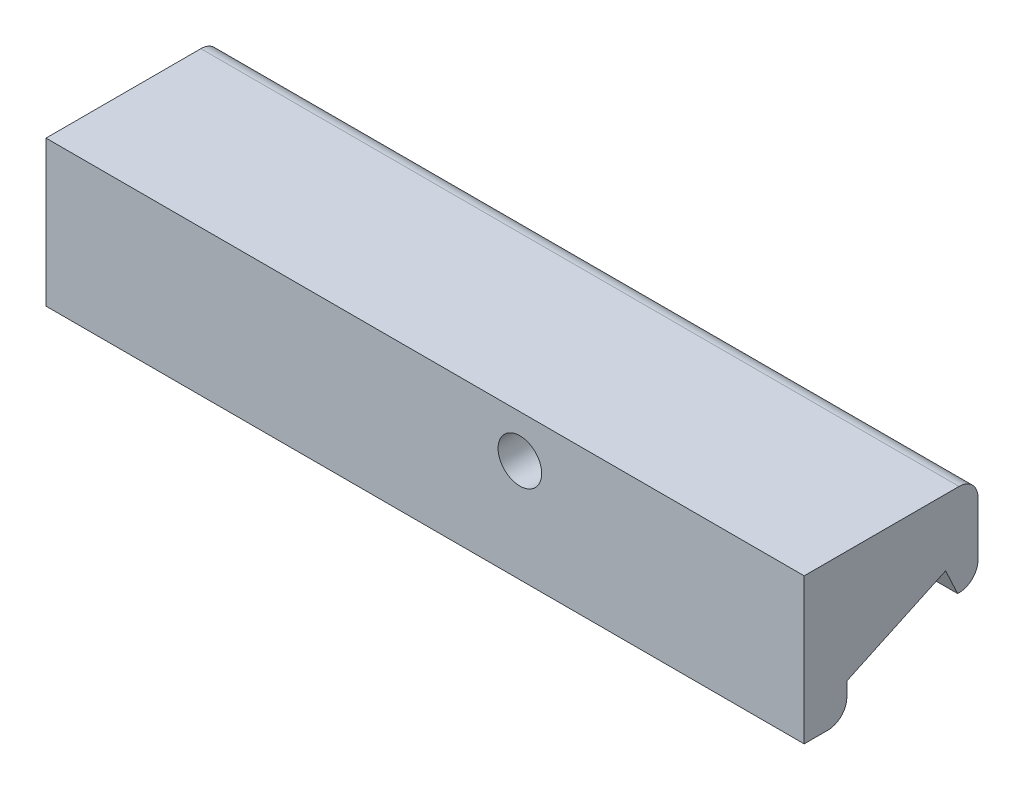
ISO-10303-21;
HEADER;
FILE_DESCRIPTION(('STEP AP214'),'2;1');
FILE_NAME('part.step','',(''),(''),'','','');
FILE_SCHEMA(('AUTOMOTIVE_DESIGN { 1 0 10303 214 1 1 1 1 }'));
ENDSEC;
DATA;
#1=APPLICATION_CONTEXT('core data for automotive mechanical design processes');
#2=APPLICATION_PROTOCOL_DEFINITION('international standard','automotive_design',2000,#1);
#3=PRODUCT_CONTEXT('',#1,'mechanical');
#4=PRODUCT('Part','Part','',(#3));
#5=PRODUCT_RELATED_PRODUCT_CATEGORY('part','',(#4));
#6=PRODUCT_DEFINITION_FORMATION('','',#4);
#7=PRODUCT_DEFINITION_CONTEXT('part definition',#1,'design');
#8=PRODUCT_DEFINITION('design','',#6,#7);
#9=PRODUCT_DEFINITION_SHAPE('','',#8);
#10=(LENGTH_UNIT() NAMED_UNIT(*) SI_UNIT(.MILLI.,.METRE.));
#11=(NAMED_UNIT(*) PLANE_ANGLE_UNIT() SI_UNIT($,.RADIAN.));
#12=(NAMED_UNIT(*) SI_UNIT($,.STERADIAN.) SOLID_ANGLE_UNIT());
#13=UNCERTAINTY_MEASURE_WITH_UNIT(LENGTH_MEASURE(1.E-05),#10,'distance_accuracy_value','');
#14=(GEOMETRIC_REPRESENTATION_CONTEXT(3) GLOBAL_UNCERTAINTY_ASSIGNED_CONTEXT((#13)) GLOBAL_UNIT_ASSIGNED_CONTEXT((#10,
#11,#12)) REPRESENTATION_CONTEXT('',''));
#15=CARTESIAN_POINT('',(0.,0.,0.));
#16=DIRECTION('',(0.,0.,1.));
#17=DIRECTION('',(1.,0.,0.));
#18=AXIS2_PLACEMENT_3D('',#15,#16,#17);
#19=CARTESIAN_POINT('',(80.,15.360110010018,0.));
#20=DIRECTION('',(0.,0.,-1.));
#21=DIRECTION('',(0.,1.,0.));
#22=AXIS2_PLACEMENT_3D('',#19,#20,#21);
#23=PLANE('',#22);
#24=CARTESIAN_POINT('',(50.,10.860110010018,0.));
#25=DIRECTION('',(0.,0.,1.));
#26=DIRECTION('',(1.,0.,0.));
#27=AXIS2_PLACEMENT_3D('',#24,#25,#26);
#28=CIRCLE('',#27,2.3);
#29=CARTESIAN_POINT('',(52.3,10.860110010018,0.));
#30=VERTEX_POINT('',#29);
#31=EDGE_CURVE('E219',#30,#30,#28,.T.);
#32=ORIENTED_EDGE('',*,*,#31,.F.);
#33=EDGE_LOOP('',(#32));
#34=FACE_BOUND('',#33,.T.);
#35=DIRECTION('',(0.,-1.,0.));
#36=VECTOR('',#35,1.);
#37=CARTESIAN_POINT('',(0.,15.360110010018,0.));
#38=LINE('',#37,#36);
#39=CARTESIAN_POINT('',(0.,15.360110010018,0.));
#40=VERTEX_POINT('',#39);
#41=CARTESIAN_POINT('',(0.,0.,0.));
#42=VERTEX_POINT('',#41);
#43=EDGE_CURVE('E147',#40,#42,#38,.T.);
#44=ORIENTED_EDGE('',*,*,#43,.T.);
#45=DIRECTION('',(-1.,0.,0.));
#46=VECTOR('',#45,1.);
#47=CARTESIAN_POINT('',(80.,0.,0.));
#48=LINE('',#47,#46);
#49=CARTESIAN_POINT('',(80.,0.,0.));
#50=VERTEX_POINT('',#49);
#51=EDGE_CURVE('E11',#50,#42,#48,.T.);
#52=ORIENTED_EDGE('',*,*,#51,.F.);
#53=DIRECTION('',(0.,-1.,0.));
#54=VECTOR('',#53,1.);
#55=CARTESIAN_POINT('',(80.,15.360110010018,0.));
#56=LINE('',#55,#54);
#57=CARTESIAN_POINT('',(80.,15.360110010018,0.));
#58=VERTEX_POINT('',#57);
#59=EDGE_CURVE('E166',#58,#50,#56,.T.);
#60=ORIENTED_EDGE('',*,*,#59,.F.);
#61=DIRECTION('',(-1.,0.,0.));
#62=VECTOR('',#61,1.);
#63=CARTESIAN_POINT('',(80.,15.360110010018,0.));
#64=LINE('',#63,#62);
#65=EDGE_CURVE('E143',#58,#40,#64,.T.);
#66=ORIENTED_EDGE('',*,*,#65,.T.);
#67=EDGE_LOOP('',(#44,#52,#60,#66));
#68=FACE_BOUND('',#67,.T.);
#69=ADVANCED_FACE('F39',(#34,#68),#23,.F.);
#70=CARTESIAN_POINT('',(80.,0.,0.));
#71=DIRECTION('',(0.,1.,0.));
#72=DIRECTION('',(0.,0.,1.));
#73=AXIS2_PLACEMENT_3D('',#70,#71,#72);
#74=PLANE('',#73);
#75=DIRECTION('',(0.,0.,-1.));
#76=VECTOR('',#75,1.);
#77=CARTESIAN_POINT('',(0.,0.,0.));
#78=LINE('',#77,#76);
#79=CARTESIAN_POINT('',(0.,0.,-2.4994615533352));
#80=VERTEX_POINT('',#79);
#81=EDGE_CURVE('E150',#42,#80,#78,.T.);
#82=ORIENTED_EDGE('',*,*,#81,.T.);
#83=DIRECTION('',(-1.,0.,0.));
#84=VECTOR('',#83,1.);
#85=CARTESIAN_POINT('',(80.,0.,-2.4994615533352));
#86=LINE('',#85,#84);
#87=CARTESIAN_POINT('',(80.,0.,-2.4994615533352));
#88=VERTEX_POINT('',#87);
#89=EDGE_CURVE('E47',#88,#80,#86,.T.);
#90=ORIENTED_EDGE('',*,*,#89,.F.);
#91=DIRECTION('',(0.,0.,-1.));
#92=VECTOR('',#91,1.);
#93=CARTESIAN_POINT('',(80.,0.,0.));
#94=LINE('',#93,#92);
#95=EDGE_CURVE('E104',#50,#88,#94,.T.);
#96=ORIENTED_EDGE('',*,*,#95,.F.);
#97=ORIENTED_EDGE('',*,*,#51,.T.);
#98=EDGE_LOOP('',(#82,#90,#96,#97));
#99=FACE_BOUND('',#98,.T.);
#100=ADVANCED_FACE('F236',(#99),#74,.F.);
#101=CARTESIAN_POINT('',(80.,2.0005384466648,-2.4994615533352));
#102=DIRECTION('',(-1.,0.,0.));
#103=DIRECTION('',(0.,0.,1.));
#104=AXIS2_PLACEMENT_3D('',#101,#102,#103);
#105=CYLINDRICAL_SURFACE('',#104,2.0005384466648);
#106=CARTESIAN_POINT('',(0.,2.0005384466648,-2.4994615533352));
#107=DIRECTION('',(1.,0.,0.));
#108=DIRECTION('',(0.,0.,-1.));
#109=AXIS2_PLACEMENT_3D('',#106,#107,#108);
#110=CIRCLE('',#109,2.0005384466648);
#111=CARTESIAN_POINT('',(0.,2.0005384466648,-4.5));
#112=VERTEX_POINT('',#111);
#113=EDGE_CURVE('E153',#80,#112,#110,.T.);
#114=ORIENTED_EDGE('',*,*,#113,.T.);
#115=DIRECTION('',(-1.,0.,0.));
#116=VECTOR('',#115,1.);
#117=CARTESIAN_POINT('',(80.,2.0005384466648,-4.5));
#118=LINE('',#117,#116);
#119=CARTESIAN_POINT('',(80.,2.0005384466648,-4.5));
#120=VERTEX_POINT('',#119);
#121=EDGE_CURVE('E179',#120,#112,#118,.T.);
#122=ORIENTED_EDGE('',*,*,#121,.F.);
#123=CARTESIAN_POINT('',(80.,2.0005384466648,-2.4994615533352));
#124=DIRECTION('',(1.,0.,0.));
#125=DIRECTION('',(0.,0.,-1.));
#126=AXIS2_PLACEMENT_3D('',#123,#124,#125);
#127=CIRCLE('',#126,2.0005384466648);
#128=EDGE_CURVE('E187',#88,#120,#127,.T.);
#129=ORIENTED_EDGE('',*,*,#128,.F.);
#130=ORIENTED_EDGE('',*,*,#89,.T.);
#131=EDGE_LOOP('',(#114,#122,#129,#130));
#132=FACE_BOUND('',#131,.T.);
#133=ADVANCED_FACE('F185',(#132),#105,.T.);
#134=CARTESIAN_POINT('',(80.,3.5,-4.5));
#135=DIRECTION('',(0.,0.,1.));
#136=DIRECTION('',(0.,-1.,0.));
#137=AXIS2_PLACEMENT_3D('',#134,#135,#136);
#138=PLANE('',#137);
#139=DIRECTION('',(0.,1.,0.));
#140=VECTOR('',#139,1.);
#141=CARTESIAN_POINT('',(0.,3.5,-4.5));
#142=LINE('',#141,#140);
#143=CARTESIAN_POINT('',(0.,3.5,-4.5));
#144=VERTEX_POINT('',#143);
#145=EDGE_CURVE('E155',#112,#144,#142,.T.);
#146=ORIENTED_EDGE('',*,*,#145,.T.);
#147=DIRECTION('',(-1.,0.,0.));
#148=VECTOR('',#147,1.);
#149=CARTESIAN_POINT('',(80.,3.5,-4.5));
#150=LINE('',#149,#148);
#151=CARTESIAN_POINT('',(80.,3.5,-4.5));
#152=VERTEX_POINT('',#151);
#153=EDGE_CURVE('E176',#152,#144,#150,.T.);
#154=ORIENTED_EDGE('',*,*,#153,.F.);
#155=DIRECTION('',(0.,1.,0.));
#156=VECTOR('',#155,1.);
#157=CARTESIAN_POINT('',(80.,3.5,-4.5));
#158=LINE('',#157,#156);
#159=EDGE_CURVE('E205',#120,#152,#158,.T.);
#160=ORIENTED_EDGE('',*,*,#159,.F.);
#161=ORIENTED_EDGE('',*,*,#121,.T.);
#162=EDGE_LOOP('',(#146,#154,#160,#161));
#163=FACE_BOUND('',#162,.T.);
#164=ADVANCED_FACE('F196',(#163),#138,.F.);
#165=CARTESIAN_POINT('',(80.,8.36011001001802,-14.9225395509215));
#166=DIRECTION('',(0.,0.906307787036651,0.422618261740697));
#167=DIRECTION('',(0.,-0.422618261740697,0.906307787036651));
#168=AXIS2_PLACEMENT_3D('',#165,#166,#167);
#169=PLANE('',#168);
#170=CARTESIAN_POINT('',(36.15,5.93005500500901,-9.71126977546074));
#171=DIRECTION('',(0.,-0.906307787036651,-0.422618261740697));
#172=DIRECTION('',(0.,0.422618261740697,-0.906307787036651));
#173=AXIS2_PLACEMENT_3D('',#170,#171,#172);
#174=CIRCLE('',#173,2.30000000000001);
#175=CARTESIAN_POINT('',(36.15,6.90207700701262,-11.795777685645));
#176=VERTEX_POINT('',#175);
#177=EDGE_CURVE('E213',#176,#176,#174,.T.);
#178=ORIENTED_EDGE('',*,*,#177,.F.);
#179=EDGE_LOOP('',(#178));
#180=FACE_BOUND('',#179,.T.);
#181=DIRECTION('',(0.,0.422618261740697,-0.906307787036651));
#182=VECTOR('',#181,1.);
#183=CARTESIAN_POINT('',(0.,8.36011001001802,-14.9225395509215));
#184=LINE('',#183,#182);
#185=CARTESIAN_POINT('',(0.,8.36011001001802,-14.9225395509215));
#186=VERTEX_POINT('',#185);
#187=EDGE_CURVE('E157',#144,#186,#184,.T.);
#188=ORIENTED_EDGE('',*,*,#187,.T.);
#189=DIRECTION('',(-1.,0.,0.));
#190=VECTOR('',#189,1.);
#191=CARTESIAN_POINT('',(80.,8.36011001001802,-14.9225395509215));
#192=LINE('',#191,#190);
#193=CARTESIAN_POINT('',(80.,8.36011001001802,-14.9225395509215));
#194=VERTEX_POINT('',#193);
#195=EDGE_CURVE('E173',#194,#186,#192,.T.);
#196=ORIENTED_EDGE('',*,*,#195,.F.);
#197=DIRECTION('',(0.,0.422618261740697,-0.906307787036651));
#198=VECTOR('',#197,1.);
#199=CARTESIAN_POINT('',(80.,8.36011001001802,-14.9225395509215));
#200=LINE('',#199,#198);
#201=EDGE_CURVE('E202',#152,#194,#200,.T.);
#202=ORIENTED_EDGE('',*,*,#201,.F.);
#203=ORIENTED_EDGE('',*,*,#153,.T.);
#204=EDGE_LOOP('',(#188,#196,#202,#203));
#205=FACE_BOUND('',#204,.T.);
#206=ADVANCED_FACE('F200',(#180,#205),#169,.F.);
#207=CARTESIAN_POINT('',(80.,5.64118664890806,-16.1903943361436));
#208=DIRECTION('',(0.,0.422618261740698,-0.906307787036651));
#209=DIRECTION('',(0.,0.906307787036651,0.422618261740698));
#210=AXIS2_PLACEMENT_3D('',#207,#208,#209);
#211=PLANE('',#210);
#212=DIRECTION('',(0.,-0.906307787036651,-0.422618261740698));
#213=VECTOR('',#212,1.);
#214=CARTESIAN_POINT('',(0.,5.64118664890806,-16.1903943361436));
#215=LINE('',#214,#213);
#216=CARTESIAN_POINT('',(0.,5.64118664890806,-16.1903943361436));
#217=VERTEX_POINT('',#216);
#218=EDGE_CURVE('E159',#186,#217,#215,.T.);
#219=ORIENTED_EDGE('',*,*,#218,.T.);
#220=DIRECTION('',(-1.,0.,0.));
#221=VECTOR('',#220,1.);
#222=CARTESIAN_POINT('',(80.,5.64118664890806,-16.1903943361436));
#223=LINE('',#222,#221);
#224=CARTESIAN_POINT('',(80.,5.64118664890806,-16.1903943361436));
#225=VERTEX_POINT('',#224);
#226=EDGE_CURVE('E170',#225,#217,#223,.T.);
#227=ORIENTED_EDGE('',*,*,#226,.F.);
#228=DIRECTION('',(0.,-0.906307787036651,-0.422618261740698));
#229=VECTOR('',#228,1.);
#230=CARTESIAN_POINT('',(80.,5.64118664890806,-16.1903943361436));
#231=LINE('',#230,#229);
#232=EDGE_CURVE('E204',#194,#225,#231,.T.);
#233=ORIENTED_EDGE('',*,*,#232,.F.);
#234=ORIENTED_EDGE('',*,*,#195,.T.);
#235=EDGE_LOOP('',(#219,#227,#233,#234));
#236=FACE_BOUND('',#235,.T.);
#237=ADVANCED_FACE('F244',(#236),#211,.F.);
#238=CARTESIAN_POINT('',(80.,7.63552847711335,-16.3407295358501));
#239=DIRECTION('',(-1.,0.,0.));
#240=DIRECTION('',(0.,0.,1.));
#241=AXIS2_PLACEMENT_3D('',#238,#239,#240);
#242=CYLINDRICAL_SURFACE('',#241,2.);
#243=CARTESIAN_POINT('',(0.,7.63552847711335,-16.3407295358501));
#244=DIRECTION('',(1.,0.,0.));
#245=DIRECTION('',(0.,0.,-1.));
#246=AXIS2_PLACEMENT_3D('',#243,#244,#245);
#247=CIRCLE('',#246,2.);
#248=CARTESIAN_POINT('',(0.,7.63552847711335,-18.3407295358501));
#249=VERTEX_POINT('',#248);
#250=EDGE_CURVE('E161',#217,#249,#247,.T.);
#251=ORIENTED_EDGE('',*,*,#250,.T.);
#252=DIRECTION('',(-1.,0.,0.));
#253=VECTOR('',#252,1.);
#254=CARTESIAN_POINT('',(80.,7.63552847711335,-18.3407295358501));
#255=LINE('',#254,#253);
#256=CARTESIAN_POINT('',(80.,7.63552847711335,-18.3407295358501));
#257=VERTEX_POINT('',#256);
#258=EDGE_CURVE('E138',#257,#249,#255,.T.);
#259=ORIENTED_EDGE('',*,*,#258,.F.);
#260=CARTESIAN_POINT('',(80.,7.63552847711335,-16.3407295358501));
#261=DIRECTION('',(1.,0.,0.));
#262=DIRECTION('',(0.,0.,-1.));
#263=AXIS2_PLACEMENT_3D('',#260,#261,#262);
#264=CIRCLE('',#263,2.);
#265=EDGE_CURVE('E129',#225,#257,#264,.T.);
#266=ORIENTED_EDGE('',*,*,#265,.F.);
#267=ORIENTED_EDGE('',*,*,#226,.T.);
#268=EDGE_LOOP('',(#251,#259,#266,#267));
#269=FACE_BOUND('',#268,.T.);
#270=ADVANCED_FACE('F241',(#269),#242,.T.);
#271=CARTESIAN_POINT('',(80.,7.63552847711335,-18.3407295358501));
#272=DIRECTION('',(0.,0.,1.));
#273=DIRECTION('',(0.,-1.,0.));
#274=AXIS2_PLACEMENT_3D('',#271,#272,#273);
#275=PLANE('',#274);
#276=DIRECTION('',(0.,1.,0.));
#277=VECTOR('',#276,1.);
#278=CARTESIAN_POINT('',(0.,7.63552847711335,-18.3407295358501));
#279=LINE('',#278,#277);
#280=CARTESIAN_POINT('',(0.,13.360110010018,-18.3407295358501));
#281=VERTEX_POINT('',#280);
#282=EDGE_CURVE('E137',#249,#281,#279,.T.);
#283=ORIENTED_EDGE('',*,*,#282,.T.);
#284=DIRECTION('',(-1.,0.,0.));
#285=VECTOR('',#284,1.);
#286=CARTESIAN_POINT('',(80.,13.360110010018,-18.3407295358501));
#287=LINE('',#286,#285);
#288=CARTESIAN_POINT('',(80.,13.360110010018,-18.3407295358501));
#289=VERTEX_POINT('',#288);
#290=EDGE_CURVE('E134',#289,#281,#287,.T.);
#291=ORIENTED_EDGE('',*,*,#290,.F.);
#292=DIRECTION('',(0.,1.,0.));
#293=VECTOR('',#292,1.);
#294=CARTESIAN_POINT('',(80.,7.63552847711335,-18.3407295358501));
#295=LINE('',#294,#293);
#296=EDGE_CURVE('E123',#257,#289,#295,.T.);
#297=ORIENTED_EDGE('',*,*,#296,.F.);
#298=ORIENTED_EDGE('',*,*,#258,.T.);
#299=EDGE_LOOP('',(#283,#291,#297,#298));
#300=FACE_BOUND('',#299,.T.);
#301=ADVANCED_FACE('F135',(#300),#275,.F.);
#302=CARTESIAN_POINT('',(80.,13.360110010018,-16.3407295358501));
#303=DIRECTION('',(-1.,0.,0.));
#304=DIRECTION('',(0.,0.,1.));
#305=AXIS2_PLACEMENT_3D('',#302,#303,#304);
#306=CYLINDRICAL_SURFACE('',#305,2.);
#307=CARTESIAN_POINT('',(0.,13.360110010018,-16.3407295358501));
#308=DIRECTION('',(1.,0.,0.));
#309=DIRECTION('',(0.,0.,1.));
#310=AXIS2_PLACEMENT_3D('',#307,#308,#309);
#311=CIRCLE('',#310,2.);
#312=CARTESIAN_POINT('',(0.,15.360110010018,-16.3407295358501));
#313=VERTEX_POINT('',#312);
#314=EDGE_CURVE('E90',#281,#313,#311,.T.);
#315=ORIENTED_EDGE('',*,*,#314,.T.);
#316=DIRECTION('',(-1.,0.,0.));
#317=VECTOR('',#316,1.);
#318=CARTESIAN_POINT('',(80.,15.360110010018,-16.3407295358501));
#319=LINE('',#318,#317);
#320=CARTESIAN_POINT('',(80.,15.360110010018,-16.3407295358501));
#321=VERTEX_POINT('',#320);
#322=EDGE_CURVE('E139',#321,#313,#319,.T.);
#323=ORIENTED_EDGE('',*,*,#322,.F.);
#324=CARTESIAN_POINT('',(80.,13.360110010018,-16.3407295358501));
#325=DIRECTION('',(1.,0.,0.));
#326=DIRECTION('',(0.,0.,1.));
#327=AXIS2_PLACEMENT_3D('',#324,#325,#326);
#328=CIRCLE('',#327,2.);
#329=EDGE_CURVE('E127',#289,#321,#328,.T.);
#330=ORIENTED_EDGE('',*,*,#329,.F.);
#331=ORIENTED_EDGE('',*,*,#290,.T.);
#332=EDGE_LOOP('',(#315,#323,#330,#331));
#333=FACE_BOUND('',#332,.T.);
#334=ADVANCED_FACE('F141',(#333),#306,.T.);
#335=CARTESIAN_POINT('',(80.,15.360110010018,-16.3407295358501));
#336=DIRECTION('',(0.,-1.,0.));
#337=DIRECTION('',(0.,0.,-1.));
#338=AXIS2_PLACEMENT_3D('',#335,#336,#337);
#339=PLANE('',#338);
#340=DIRECTION('',(0.,0.,1.));
#341=VECTOR('',#340,1.);
#342=CARTESIAN_POINT('',(0.,15.360110010018,-16.3407295358501));
#343=LINE('',#342,#341);
#344=EDGE_CURVE('E96',#313,#40,#343,.T.);
#345=ORIENTED_EDGE('',*,*,#344,.T.);
#346=ORIENTED_EDGE('',*,*,#65,.F.);
#347=DIRECTION('',(0.,0.,1.));
#348=VECTOR('',#347,1.);
#349=CARTESIAN_POINT('',(80.,15.360110010018,-16.3407295358501));
#350=LINE('',#349,#348);
#351=EDGE_CURVE('E55',#321,#58,#350,.T.);
#352=ORIENTED_EDGE('',*,*,#351,.F.);
#353=ORIENTED_EDGE('',*,*,#322,.T.);
#354=EDGE_LOOP('',(#345,#346,#352,#353));
#355=FACE_BOUND('',#354,.T.);
#356=ADVANCED_FACE('F308',(#355),#339,.F.);
#357=CARTESIAN_POINT('',(80.,2.0005384466648,-2.4994615533352));
#358=DIRECTION('',(1.,0.,0.));
#359=DIRECTION('',(0.,0.,-1.));
#360=AXIS2_PLACEMENT_3D('',#357,#358,#359);
#361=PLANE('',#360);
#362=ORIENTED_EDGE('',*,*,#59,.T.);
#363=ORIENTED_EDGE('',*,*,#95,.T.);
#364=ORIENTED_EDGE('',*,*,#128,.T.);
#365=ORIENTED_EDGE('',*,*,#159,.T.);
#366=ORIENTED_EDGE('',*,*,#201,.T.);
#367=ORIENTED_EDGE('',*,*,#232,.T.);
#368=ORIENTED_EDGE('',*,*,#265,.T.);
#369=ORIENTED_EDGE('',*,*,#296,.T.);
#370=ORIENTED_EDGE('',*,*,#329,.T.);
#371=ORIENTED_EDGE('',*,*,#351,.T.);
#372=EDGE_LOOP('',(#362,#363,#364,#365,#366,#367,#368,#369,#370,#371));
#373=FACE_BOUND('',#372,.T.);
#374=ADVANCED_FACE('F125',(#373),#361,.T.);
#375=CARTESIAN_POINT('',(0.,2.0005384466648,-2.4994615533352));
#376=DIRECTION('',(1.,0.,0.));
#377=DIRECTION('',(0.,0.,-1.));
#378=AXIS2_PLACEMENT_3D('',#375,#376,#377);
#379=PLANE('',#378);
#380=ORIENTED_EDGE('',*,*,#43,.F.);
#381=ORIENTED_EDGE('',*,*,#344,.F.);
#382=ORIENTED_EDGE('',*,*,#314,.F.);
#383=ORIENTED_EDGE('',*,*,#282,.F.);
#384=ORIENTED_EDGE('',*,*,#250,.F.);
#385=ORIENTED_EDGE('',*,*,#218,.F.);
#386=ORIENTED_EDGE('',*,*,#187,.F.);
#387=ORIENTED_EDGE('',*,*,#145,.F.);
#388=ORIENTED_EDGE('',*,*,#113,.F.);
#389=ORIENTED_EDGE('',*,*,#81,.F.);
#390=EDGE_LOOP('',(#380,#381,#382,#383,#384,#385,#386,#387,#388,#389));
#391=FACE_BOUND('',#390,.T.);
#392=ADVANCED_FACE('F191',(#391),#379,.F.);
#393=CARTESIAN_POINT('',(36.15,10.0084400466739,-7.80948759762761));
#394=DIRECTION('',(0.,-0.906307787036651,-0.422618261740697));
#395=DIRECTION('',(0.,0.422618261740697,-0.906307787036651));
#396=AXIS2_PLACEMENT_3D('',#393,#394,#395);
#397=CYLINDRICAL_SURFACE('',#396,2.30000000000001);
#398=CARTESIAN_POINT('',(36.15,10.0084400466739,-7.80948759762761));
#399=DIRECTION('',(0.,-0.906307787036651,-0.422618261740697));
#400=DIRECTION('',(0.,0.422618261740697,-0.906307787036651));
#401=AXIS2_PLACEMENT_3D('',#398,#399,#400);
#402=CIRCLE('',#401,2.30000000000001);
#403=CARTESIAN_POINT('',(36.15,10.9804620486776,-9.89399550781191));
#404=VERTEX_POINT('',#403);
#405=EDGE_CURVE('E151',#404,#404,#402,.T.);
#406=ORIENTED_EDGE('',*,*,#405,.F.);
#407=EDGE_LOOP('',(#406));
#408=FACE_BOUND('',#407,.T.);
#409=ORIENTED_EDGE('',*,*,#177,.T.);
#410=EDGE_LOOP('',(#409));
#411=FACE_BOUND('',#410,.T.);
#412=ADVANCED_FACE('F332',(#408,#411),#397,.F.);
#413=CARTESIAN_POINT('',(36.15,10.0084400466739,-7.80948759762761));
#414=DIRECTION('',(0.,-0.906307787036651,-0.422618261740697));
#415=DIRECTION('',(0.,0.422618261740697,-0.906307787036651));
#416=AXIS2_PLACEMENT_3D('',#413,#414,#415);
#417=PLANE('',#416);
#418=ORIENTED_EDGE('',*,*,#405,.T.);
#419=EDGE_LOOP('',(#418));
#420=FACE_BOUND('',#419,.T.);
#421=ADVANCED_FACE('F230',(#420),#417,.T.);
#422=CARTESIAN_POINT('',(50.,10.860110010018,-4.5));
#423=DIRECTION('',(0.,0.,1.));
#424=DIRECTION('',(1.,0.,0.));
#425=AXIS2_PLACEMENT_3D('',#422,#423,#424);
#426=CYLINDRICAL_SURFACE('',#425,2.3);
#427=CARTESIAN_POINT('',(50.,10.860110010018,-4.5));
#428=DIRECTION('',(0.,0.,1.));
#429=DIRECTION('',(1.,0.,0.));
#430=AXIS2_PLACEMENT_3D('',#427,#428,#429);
#431=CIRCLE('',#430,2.3);
#432=CARTESIAN_POINT('',(52.3,10.860110010018,-4.5));
#433=VERTEX_POINT('',#432);
#434=EDGE_CURVE('E216',#433,#433,#431,.T.);
#435=ORIENTED_EDGE('',*,*,#434,.F.);
#436=EDGE_LOOP('',(#435));
#437=FACE_BOUND('',#436,.T.);
#438=ORIENTED_EDGE('',*,*,#31,.T.);
#439=EDGE_LOOP('',(#438));
#440=FACE_BOUND('',#439,.T.);
#441=ADVANCED_FACE('F227',(#437,#440),#426,.F.);
#442=CARTESIAN_POINT('',(50.,10.860110010018,-4.5));
#443=DIRECTION('',(0.,0.,1.));
#444=DIRECTION('',(1.,0.,0.));
#445=AXIS2_PLACEMENT_3D('',#442,#443,#444);
#446=PLANE('',#445);
#447=ORIENTED_EDGE('',*,*,#434,.T.);
#448=EDGE_LOOP('',(#447));
#449=FACE_BOUND('',#448,.T.);
#450=ADVANCED_FACE('F225',(#449),#446,.T.);
#451=CLOSED_SHELL('',(#69,#100,#133,#164,#206,#237,#270,#301,#334,#356,#374,#392,#412,#421,#441,#450));
#452=MANIFOLD_SOLID_BREP('B2',#451);
#453=ADVANCED_BREP_SHAPE_REPRESENTATION('',(#18,#452),#14);
#454=SHAPE_DEFINITION_REPRESENTATION(#9,#453);
ENDSEC;
END-ISO-10303-21;
